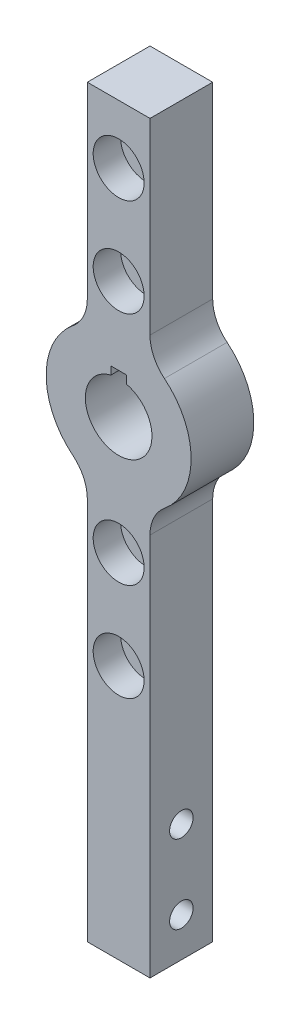
ISO-10303-21;
HEADER;
FILE_DESCRIPTION(('STEP AP214'),'2;1');
FILE_NAME('part.step','',(''),(''),'','','');
FILE_SCHEMA(('AUTOMOTIVE_DESIGN { 1 0 10303 214 1 1 1 1 }'));
ENDSEC;
DATA;
#1=APPLICATION_CONTEXT('core data for automotive mechanical design processes');
#2=APPLICATION_PROTOCOL_DEFINITION('international standard','automotive_design',2000,#1);
#3=PRODUCT_CONTEXT('',#1,'mechanical');
#4=PRODUCT('Part','Part','',(#3));
#5=PRODUCT_RELATED_PRODUCT_CATEGORY('part','',(#4));
#6=PRODUCT_DEFINITION_FORMATION('','',#4);
#7=PRODUCT_DEFINITION_CONTEXT('part definition',#1,'design');
#8=PRODUCT_DEFINITION('design','',#6,#7);
#9=PRODUCT_DEFINITION_SHAPE('','',#8);
#10=(LENGTH_UNIT() NAMED_UNIT(*) SI_UNIT(.MILLI.,.METRE.));
#11=(NAMED_UNIT(*) PLANE_ANGLE_UNIT() SI_UNIT($,.RADIAN.));
#12=(NAMED_UNIT(*) SI_UNIT($,.STERADIAN.) SOLID_ANGLE_UNIT());
#13=UNCERTAINTY_MEASURE_WITH_UNIT(LENGTH_MEASURE(1.E-05),#10,'distance_accuracy_value','');
#14=(GEOMETRIC_REPRESENTATION_CONTEXT(3) GLOBAL_UNCERTAINTY_ASSIGNED_CONTEXT((#13)) GLOBAL_UNIT_ASSIGNED_CONTEXT((#10,
#11,#12)) REPRESENTATION_CONTEXT('',''));
#15=CARTESIAN_POINT('',(0.,0.,0.));
#16=DIRECTION('',(0.,0.,1.));
#17=DIRECTION('',(1.,0.,0.));
#18=AXIS2_PLACEMENT_3D('',#15,#16,#17);
#19=CARTESIAN_POINT('',(0.,0.,-8.));
#20=DIRECTION('',(0.,0.,1.));
#21=DIRECTION('',(1.,0.,0.));
#22=AXIS2_PLACEMENT_3D('',#19,#20,#21);
#23=PLANE('',#22);
#24=CARTESIAN_POINT('',(0.,-55.,-8.));
#25=DIRECTION('',(0.,0.,-1.));
#26=DIRECTION('',(1.,0.,0.));
#27=AXIS2_PLACEMENT_3D('',#24,#25,#26);
#28=CIRCLE('',#27,3.);
#29=CARTESIAN_POINT('',(3.,-55.,-8.));
#30=VERTEX_POINT('',#29);
#31=EDGE_CURVE('E241',#30,#30,#28,.T.);
#32=ORIENTED_EDGE('',*,*,#31,.F.);
#33=EDGE_LOOP('',(#32));
#34=FACE_BOUND('',#33,.T.);
#35=CARTESIAN_POINT('',(0.,30.,-8.));
#36=DIRECTION('',(0.,0.,1.));
#37=DIRECTION('',(1.,0.,0.));
#38=AXIS2_PLACEMENT_3D('',#35,#36,#37);
#39=CIRCLE('',#38,3.);
#40=CARTESIAN_POINT('',(3.,30.,-8.));
#41=VERTEX_POINT('',#40);
#42=EDGE_CURVE('E247',#41,#41,#39,.T.);
#43=ORIENTED_EDGE('',*,*,#42,.T.);
#44=EDGE_LOOP('',(#43));
#45=FACE_BOUND('',#44,.T.);
#46=CARTESIAN_POINT('',(0.,55.,-8.));
#47=DIRECTION('',(0.,0.,1.));
#48=DIRECTION('',(1.,0.,0.));
#49=AXIS2_PLACEMENT_3D('',#46,#47,#48);
#50=CIRCLE('',#49,3.);
#51=CARTESIAN_POINT('',(3.,55.,-8.));
#52=VERTEX_POINT('',#51);
#53=EDGE_CURVE('E253',#52,#52,#50,.T.);
#54=ORIENTED_EDGE('',*,*,#53,.T.);
#55=EDGE_LOOP('',(#54));
#56=FACE_BOUND('',#55,.T.);
#57=CARTESIAN_POINT('',(0.,0.,-8.));
#58=DIRECTION('',(0.,0.,1.));
#59=DIRECTION('',(1.,0.,0.));
#60=AXIS2_PLACEMENT_3D('',#57,#58,#59);
#61=CIRCLE('',#60,18.5);
#62=CARTESIAN_POINT('',(11.6842105263158,-14.3432640767969,-8.));
#63=VERTEX_POINT('',#62);
#64=CARTESIAN_POINT('',(11.6842105263158,14.3432640767969,-8.));
#65=VERTEX_POINT('',#64);
#66=EDGE_CURVE('E174',#63,#65,#61,.T.);
#67=ORIENTED_EDGE('',*,*,#66,.F.);
#68=CARTESIAN_POINT('',(18.,-22.0963797939843,-8.));
#69=DIRECTION('',(0.,0.,1.));
#70=DIRECTION('',(1.,0.,0.));
#71=AXIS2_PLACEMENT_3D('',#68,#69,#70);
#72=CIRCLE('',#71,10.);
#73=CARTESIAN_POINT('',(8.00000000000002,-22.0963797939843,-8.));
#74=VERTEX_POINT('',#73);
#75=EDGE_CURVE('E209',#63,#74,#72,.T.);
#76=ORIENTED_EDGE('',*,*,#75,.T.);
#77=DIRECTION('',(0.,1.,0.));
#78=VECTOR('',#77,1.);
#79=CARTESIAN_POINT('',(8.00000000000001,-120.,-8.));
#80=LINE('',#79,#78);
#81=CARTESIAN_POINT('',(8.00000000000001,-120.,-8.));
#82=VERTEX_POINT('',#81);
#83=EDGE_CURVE('E292',#82,#74,#80,.T.);
#84=ORIENTED_EDGE('',*,*,#83,.F.);
#85=DIRECTION('',(1.,0.,0.));
#86=VECTOR('',#85,1.);
#87=CARTESIAN_POINT('',(-7.99999999999999,-120.,-8.));
#88=LINE('',#87,#86);
#89=CARTESIAN_POINT('',(-7.99999999999999,-120.,-8.));
#90=VERTEX_POINT('',#89);
#91=EDGE_CURVE('E300',#90,#82,#88,.T.);
#92=ORIENTED_EDGE('',*,*,#91,.F.);
#93=DIRECTION('',(0.,-1.,0.));
#94=VECTOR('',#93,1.);
#95=CARTESIAN_POINT('',(-7.99999999999999,-120.,-8.));
#96=LINE('',#95,#94);
#97=CARTESIAN_POINT('',(-8.00000000000001,-22.0963797939843,-8.));
#98=VERTEX_POINT('',#97);
#99=EDGE_CURVE('E307',#98,#90,#96,.T.);
#100=ORIENTED_EDGE('',*,*,#99,.F.);
#101=CARTESIAN_POINT('',(-18.,-22.0963797939843,-8.));
#102=DIRECTION('',(0.,0.,1.));
#103=DIRECTION('',(1.,0.,0.));
#104=AXIS2_PLACEMENT_3D('',#101,#102,#103);
#105=CIRCLE('',#104,10.);
#106=CARTESIAN_POINT('',(-11.6842105263158,-14.3432640767969,-8.));
#107=VERTEX_POINT('',#106);
#108=EDGE_CURVE('E213',#98,#107,#105,.T.);
#109=ORIENTED_EDGE('',*,*,#108,.T.);
#110=CARTESIAN_POINT('',(-11.6842105263158,14.3432640767969,-8.));
#111=VERTEX_POINT('',#110);
#112=EDGE_CURVE('E178',#111,#107,#61,.T.);
#113=ORIENTED_EDGE('',*,*,#112,.F.);
#114=CARTESIAN_POINT('',(-18.,22.0963797939844,-8.));
#115=DIRECTION('',(0.,0.,1.));
#116=DIRECTION('',(1.,0.,0.));
#117=AXIS2_PLACEMENT_3D('',#114,#115,#116);
#118=CIRCLE('',#117,10.);
#119=CARTESIAN_POINT('',(-7.99999999999999,22.0963797939844,-8.));
#120=VERTEX_POINT('',#119);
#121=EDGE_CURVE('E217',#111,#120,#118,.T.);
#122=ORIENTED_EDGE('',*,*,#121,.T.);
#123=DIRECTION('',(0.,-1.,0.));
#124=VECTOR('',#123,1.);
#125=CARTESIAN_POINT('',(-8.,70.,-8.));
#126=LINE('',#125,#124);
#127=CARTESIAN_POINT('',(-8.,70.,-8.));
#128=VERTEX_POINT('',#127);
#129=EDGE_CURVE('E319',#128,#120,#126,.T.);
#130=ORIENTED_EDGE('',*,*,#129,.F.);
#131=DIRECTION('',(-1.,0.,0.));
#132=VECTOR('',#131,1.);
#133=CARTESIAN_POINT('',(-8.,70.,-8.));
#134=LINE('',#133,#132);
#135=CARTESIAN_POINT('',(8.,70.,-8.));
#136=VERTEX_POINT('',#135);
#137=EDGE_CURVE('E326',#136,#128,#134,.T.);
#138=ORIENTED_EDGE('',*,*,#137,.F.);
#139=DIRECTION('',(0.,1.,0.));
#140=VECTOR('',#139,1.);
#141=CARTESIAN_POINT('',(8.,70.,-8.));
#142=LINE('',#141,#140);
#143=CARTESIAN_POINT('',(7.99999999999999,22.0963797939844,-8.));
#144=VERTEX_POINT('',#143);
#145=EDGE_CURVE('E315',#144,#136,#142,.T.);
#146=ORIENTED_EDGE('',*,*,#145,.F.);
#147=CARTESIAN_POINT('',(18.,22.0963797939844,-8.));
#148=DIRECTION('',(0.,0.,1.));
#149=DIRECTION('',(1.,0.,0.));
#150=AXIS2_PLACEMENT_3D('',#147,#148,#149);
#151=CIRCLE('',#150,10.);
#152=EDGE_CURVE('E44',#144,#65,#151,.T.);
#153=ORIENTED_EDGE('',*,*,#152,.T.);
#154=EDGE_LOOP('',(#67,#76,#84,#92,#100,#109,#113,#122,#130,#138,#146,#153));
#155=FACE_BOUND('',#154,.T.);
#156=CARTESIAN_POINT('',(0.,0.,-8.));
#157=DIRECTION('',(0.,0.,1.));
#158=DIRECTION('',(1.,0.,0.));
#159=AXIS2_PLACEMENT_3D('',#156,#157,#158);
#160=CIRCLE('',#159,8.5);
#161=CARTESIAN_POINT('',(-2.,8.26135582092915,-8.));
#162=VERTEX_POINT('',#161);
#163=CARTESIAN_POINT('',(2.,8.26135582092915,-8.));
#164=VERTEX_POINT('',#163);
#165=EDGE_CURVE('E175',#162,#164,#160,.T.);
#166=ORIENTED_EDGE('',*,*,#165,.T.);
#167=DIRECTION('',(0.,-1.,0.));
#168=VECTOR('',#167,1.);
#169=CARTESIAN_POINT('',(2.,10.3,-8.));
#170=LINE('',#169,#168);
#171=CARTESIAN_POINT('',(2.,10.3,-8.));
#172=VERTEX_POINT('',#171);
#173=EDGE_CURVE('E155',#172,#164,#170,.T.);
#174=ORIENTED_EDGE('',*,*,#173,.F.);
#175=DIRECTION('',(1.,0.,0.));
#176=VECTOR('',#175,1.);
#177=CARTESIAN_POINT('',(-2.,10.3,-8.));
#178=LINE('',#177,#176);
#179=CARTESIAN_POINT('',(-2.,10.3,-8.));
#180=VERTEX_POINT('',#179);
#181=EDGE_CURVE('E170',#180,#172,#178,.T.);
#182=ORIENTED_EDGE('',*,*,#181,.F.);
#183=DIRECTION('',(0.,1.,0.));
#184=VECTOR('',#183,1.);
#185=CARTESIAN_POINT('',(-2.,10.3,-8.));
#186=LINE('',#185,#184);
#187=EDGE_CURVE('E285',#162,#180,#186,.T.);
#188=ORIENTED_EDGE('',*,*,#187,.F.);
#189=EDGE_LOOP('',(#166,#174,#182,#188));
#190=FACE_BOUND('',#189,.T.);
#191=CARTESIAN_POINT('',(0.,-30.,-8.));
#192=DIRECTION('',(0.,0.,-1.));
#193=DIRECTION('',(1.,0.,0.));
#194=AXIS2_PLACEMENT_3D('',#191,#192,#193);
#195=CIRCLE('',#194,3.);
#196=CARTESIAN_POINT('',(3.,-30.,-8.));
#197=VERTEX_POINT('',#196);
#198=EDGE_CURVE('E228',#197,#197,#195,.T.);
#199=ORIENTED_EDGE('',*,*,#198,.F.);
#200=EDGE_LOOP('',(#199));
#201=FACE_BOUND('',#200,.T.);
#202=ADVANCED_FACE('F35',(#34,#45,#56,#155,#190,#201),#23,.F.);
#203=CARTESIAN_POINT('',(0.,-30.,1.));
#204=DIRECTION('',(0.,0.,1.));
#205=DIRECTION('',(1.,0.,0.));
#206=AXIS2_PLACEMENT_3D('',#203,#204,#205);
#207=PLANE('',#206);
#208=CARTESIAN_POINT('',(0.,-30.,1.));
#209=DIRECTION('',(0.,0.,-1.));
#210=DIRECTION('',(1.,0.,0.));
#211=AXIS2_PLACEMENT_3D('',#208,#209,#210);
#212=CIRCLE('',#211,6.5);
#213=CARTESIAN_POINT('',(6.5,-30.,1.));
#214=VERTEX_POINT('',#213);
#215=EDGE_CURVE('E259',#214,#214,#212,.T.);
#216=ORIENTED_EDGE('',*,*,#215,.F.);
#217=EDGE_LOOP('',(#216));
#218=FACE_BOUND('',#217,.T.);
#219=CARTESIAN_POINT('',(0.,-30.,1.));
#220=DIRECTION('',(0.,0.,-1.));
#221=DIRECTION('',(1.,0.,0.));
#222=AXIS2_PLACEMENT_3D('',#219,#220,#221);
#223=CIRCLE('',#222,3.);
#224=CARTESIAN_POINT('',(3.,-30.,1.));
#225=VERTEX_POINT('',#224);
#226=EDGE_CURVE('E223',#225,#225,#223,.T.);
#227=ORIENTED_EDGE('',*,*,#226,.T.);
#228=EDGE_LOOP('',(#227));
#229=FACE_BOUND('',#228,.T.);
#230=ADVANCED_FACE('F397',(#218,#229),#207,.T.);
#231=CARTESIAN_POINT('',(0.,-55.,1.));
#232=DIRECTION('',(0.,0.,1.));
#233=DIRECTION('',(1.,0.,0.));
#234=AXIS2_PLACEMENT_3D('',#231,#232,#233);
#235=PLANE('',#234);
#236=CARTESIAN_POINT('',(0.,-55.,1.));
#237=DIRECTION('',(0.,0.,-1.));
#238=DIRECTION('',(1.,0.,0.));
#239=AXIS2_PLACEMENT_3D('',#236,#237,#238);
#240=CIRCLE('',#239,6.5);
#241=CARTESIAN_POINT('',(6.5,-55.,1.));
#242=VERTEX_POINT('',#241);
#243=EDGE_CURVE('E265',#242,#242,#240,.T.);
#244=ORIENTED_EDGE('',*,*,#243,.F.);
#245=EDGE_LOOP('',(#244));
#246=FACE_BOUND('',#245,.T.);
#247=CARTESIAN_POINT('',(0.,-55.,1.));
#248=DIRECTION('',(0.,0.,-1.));
#249=DIRECTION('',(1.,0.,0.));
#250=AXIS2_PLACEMENT_3D('',#247,#248,#249);
#251=CIRCLE('',#250,3.);
#252=CARTESIAN_POINT('',(3.,-55.,1.));
#253=VERTEX_POINT('',#252);
#254=EDGE_CURVE('E239',#253,#253,#251,.T.);
#255=ORIENTED_EDGE('',*,*,#254,.T.);
#256=EDGE_LOOP('',(#255));
#257=FACE_BOUND('',#256,.T.);
#258=ADVANCED_FACE('F403',(#246,#257),#235,.T.);
#259=CARTESIAN_POINT('',(0.,0.,8.));
#260=DIRECTION('',(0.,0.,1.));
#261=DIRECTION('',(1.,0.,0.));
#262=AXIS2_PLACEMENT_3D('',#259,#260,#261);
#263=PLANE('',#262);
#264=CARTESIAN_POINT('',(0.,-55.,8.));
#265=DIRECTION('',(0.,0.,-1.));
#266=DIRECTION('',(1.,0.,0.));
#267=AXIS2_PLACEMENT_3D('',#264,#265,#266);
#268=CIRCLE('',#267,6.5);
#269=CARTESIAN_POINT('',(6.5,-55.,8.));
#270=VERTEX_POINT('',#269);
#271=EDGE_CURVE('E262',#270,#270,#268,.T.);
#272=ORIENTED_EDGE('',*,*,#271,.T.);
#273=EDGE_LOOP('',(#272));
#274=FACE_BOUND('',#273,.T.);
#275=CARTESIAN_POINT('',(0.,30.,8.));
#276=DIRECTION('',(0.,0.,1.));
#277=DIRECTION('',(1.,0.,0.));
#278=AXIS2_PLACEMENT_3D('',#275,#276,#277);
#279=CIRCLE('',#278,6.5);
#280=CARTESIAN_POINT('',(6.5,30.,8.));
#281=VERTEX_POINT('',#280);
#282=EDGE_CURVE('E268',#281,#281,#279,.T.);
#283=ORIENTED_EDGE('',*,*,#282,.F.);
#284=EDGE_LOOP('',(#283));
#285=FACE_BOUND('',#284,.T.);
#286=CARTESIAN_POINT('',(0.,55.,8.));
#287=DIRECTION('',(0.,0.,1.));
#288=DIRECTION('',(1.,0.,0.));
#289=AXIS2_PLACEMENT_3D('',#286,#287,#288);
#290=CIRCLE('',#289,6.5);
#291=CARTESIAN_POINT('',(6.5,55.,8.));
#292=VERTEX_POINT('',#291);
#293=EDGE_CURVE('E274',#292,#292,#290,.T.);
#294=ORIENTED_EDGE('',*,*,#293,.F.);
#295=EDGE_LOOP('',(#294));
#296=FACE_BOUND('',#295,.T.);
#297=DIRECTION('',(0.,-1.,0.));
#298=VECTOR('',#297,1.);
#299=CARTESIAN_POINT('',(2.,10.3,8.));
#300=LINE('',#299,#298);
#301=CARTESIAN_POINT('',(2.,10.3,8.));
#302=VERTEX_POINT('',#301);
#303=CARTESIAN_POINT('',(2.,8.26135582092915,8.));
#304=VERTEX_POINT('',#303);
#305=EDGE_CURVE('E152',#302,#304,#300,.T.);
#306=ORIENTED_EDGE('',*,*,#305,.T.);
#307=CARTESIAN_POINT('',(0.,0.,8.));
#308=DIRECTION('',(0.,0.,1.));
#309=DIRECTION('',(1.,0.,0.));
#310=AXIS2_PLACEMENT_3D('',#307,#308,#309);
#311=CIRCLE('',#310,8.5);
#312=CARTESIAN_POINT('',(-2.,8.26135582092915,8.));
#313=VERTEX_POINT('',#312);
#314=EDGE_CURVE('E167',#313,#304,#311,.T.);
#315=ORIENTED_EDGE('',*,*,#314,.F.);
#316=DIRECTION('',(0.,1.,0.));
#317=VECTOR('',#316,1.);
#318=CARTESIAN_POINT('',(-2.,10.3,8.));
#319=LINE('',#318,#317);
#320=CARTESIAN_POINT('',(-2.,10.3,8.));
#321=VERTEX_POINT('',#320);
#322=EDGE_CURVE('E169',#313,#321,#319,.T.);
#323=ORIENTED_EDGE('',*,*,#322,.T.);
#324=DIRECTION('',(1.,0.,0.));
#325=VECTOR('',#324,1.);
#326=CARTESIAN_POINT('',(-2.,10.3,8.));
#327=LINE('',#326,#325);
#328=EDGE_CURVE('E161',#321,#302,#327,.T.);
#329=ORIENTED_EDGE('',*,*,#328,.T.);
#330=EDGE_LOOP('',(#306,#315,#323,#329));
#331=FACE_BOUND('',#330,.T.);
#332=DIRECTION('',(0.,-1.,0.));
#333=VECTOR('',#332,1.);
#334=CARTESIAN_POINT('',(-8.,70.,8.));
#335=LINE('',#334,#333);
#336=CARTESIAN_POINT('',(-8.,70.,8.));
#337=VERTEX_POINT('',#336);
#338=CARTESIAN_POINT('',(-7.99999999999999,22.0963797939844,8.));
#339=VERTEX_POINT('',#338);
#340=EDGE_CURVE('E321',#337,#339,#335,.T.);
#341=ORIENTED_EDGE('',*,*,#340,.T.);
#342=CARTESIAN_POINT('',(-18.,22.0963797939844,8.));
#343=DIRECTION('',(0.,0.,1.));
#344=DIRECTION('',(1.,0.,0.));
#345=AXIS2_PLACEMENT_3D('',#342,#343,#344);
#346=CIRCLE('',#345,10.);
#347=CARTESIAN_POINT('',(-11.6842105263158,14.3432640767969,8.));
#348=VERTEX_POINT('',#347);
#349=EDGE_CURVE('E219',#339,#348,#346,.F.);
#350=ORIENTED_EDGE('',*,*,#349,.T.);
#351=CARTESIAN_POINT('',(0.,0.,8.));
#352=DIRECTION('',(0.,0.,1.));
#353=DIRECTION('',(1.,0.,0.));
#354=AXIS2_PLACEMENT_3D('',#351,#352,#353);
#355=CIRCLE('',#354,18.5);
#356=CARTESIAN_POINT('',(-11.6842105263158,-14.3432640767969,8.));
#357=VERTEX_POINT('',#356);
#358=EDGE_CURVE('E185',#348,#357,#355,.T.);
#359=ORIENTED_EDGE('',*,*,#358,.T.);
#360=CARTESIAN_POINT('',(-18.,-22.0963797939843,8.));
#361=DIRECTION('',(0.,0.,1.));
#362=DIRECTION('',(1.,0.,0.));
#363=AXIS2_PLACEMENT_3D('',#360,#361,#362);
#364=CIRCLE('',#363,10.);
#365=CARTESIAN_POINT('',(-8.00000000000001,-22.0963797939843,8.));
#366=VERTEX_POINT('',#365);
#367=EDGE_CURVE('E215',#357,#366,#364,.F.);
#368=ORIENTED_EDGE('',*,*,#367,.T.);
#369=DIRECTION('',(0.,-1.,0.));
#370=VECTOR('',#369,1.);
#371=CARTESIAN_POINT('',(-7.99999999999999,-120.,8.));
#372=LINE('',#371,#370);
#373=CARTESIAN_POINT('',(-7.99999999999999,-120.,8.));
#374=VERTEX_POINT('',#373);
#375=EDGE_CURVE('E299',#366,#374,#372,.T.);
#376=ORIENTED_EDGE('',*,*,#375,.T.);
#377=DIRECTION('',(1.,0.,0.));
#378=VECTOR('',#377,1.);
#379=CARTESIAN_POINT('',(-7.99999999999999,-120.,8.));
#380=LINE('',#379,#378);
#381=CARTESIAN_POINT('',(8.00000000000001,-120.,8.));
#382=VERTEX_POINT('',#381);
#383=EDGE_CURVE('E302',#374,#382,#380,.T.);
#384=ORIENTED_EDGE('',*,*,#383,.T.);
#385=DIRECTION('',(0.,1.,0.));
#386=VECTOR('',#385,1.);
#387=CARTESIAN_POINT('',(8.00000000000001,-120.,8.));
#388=LINE('',#387,#386);
#389=CARTESIAN_POINT('',(8.00000000000002,-22.0963797939843,8.));
#390=VERTEX_POINT('',#389);
#391=EDGE_CURVE('E296',#382,#390,#388,.T.);
#392=ORIENTED_EDGE('',*,*,#391,.T.);
#393=CARTESIAN_POINT('',(18.,-22.0963797939843,8.));
#394=DIRECTION('',(0.,0.,1.));
#395=DIRECTION('',(1.,0.,0.));
#396=AXIS2_PLACEMENT_3D('',#393,#394,#395);
#397=CIRCLE('',#396,10.);
#398=CARTESIAN_POINT('',(11.6842105263158,-14.3432640767969,8.));
#399=VERTEX_POINT('',#398);
#400=EDGE_CURVE('E211',#390,#399,#397,.F.);
#401=ORIENTED_EDGE('',*,*,#400,.T.);
#402=CARTESIAN_POINT('',(11.6842105263158,14.3432640767969,8.));
#403=VERTEX_POINT('',#402);
#404=EDGE_CURVE('E188',#399,#403,#355,.T.);
#405=ORIENTED_EDGE('',*,*,#404,.T.);
#406=CARTESIAN_POINT('',(18.,22.0963797939844,8.));
#407=DIRECTION('',(0.,0.,1.));
#408=DIRECTION('',(1.,0.,0.));
#409=AXIS2_PLACEMENT_3D('',#406,#407,#408);
#410=CIRCLE('',#409,10.);
#411=CARTESIAN_POINT('',(7.99999999999999,22.0963797939844,8.));
#412=VERTEX_POINT('',#411);
#413=EDGE_CURVE('E11',#403,#412,#410,.F.);
#414=ORIENTED_EDGE('',*,*,#413,.T.);
#415=DIRECTION('',(0.,1.,0.));
#416=VECTOR('',#415,1.);
#417=CARTESIAN_POINT('',(8.,70.,8.));
#418=LINE('',#417,#416);
#419=CARTESIAN_POINT('',(8.,70.,8.));
#420=VERTEX_POINT('',#419);
#421=EDGE_CURVE('E316',#412,#420,#418,.T.);
#422=ORIENTED_EDGE('',*,*,#421,.T.);
#423=DIRECTION('',(-1.,0.,0.));
#424=VECTOR('',#423,1.);
#425=CARTESIAN_POINT('',(-8.,70.,8.));
#426=LINE('',#425,#424);
#427=EDGE_CURVE('E318',#420,#337,#426,.T.);
#428=ORIENTED_EDGE('',*,*,#427,.T.);
#429=EDGE_LOOP('',(#341,#350,#359,#368,#376,#384,#392,#401,#405,#414,#422,#428));
#430=FACE_BOUND('',#429,.T.);
#431=CARTESIAN_POINT('',(0.,-30.,8.));
#432=DIRECTION('',(0.,0.,-1.));
#433=DIRECTION('',(1.,0.,0.));
#434=AXIS2_PLACEMENT_3D('',#431,#432,#433);
#435=CIRCLE('',#434,6.5);
#436=CARTESIAN_POINT('',(6.5,-30.,8.));
#437=VERTEX_POINT('',#436);
#438=EDGE_CURVE('E256',#437,#437,#435,.T.);
#439=ORIENTED_EDGE('',*,*,#438,.T.);
#440=EDGE_LOOP('',(#439));
#441=FACE_BOUND('',#440,.T.);
#442=ADVANCED_FACE('F165',(#274,#285,#296,#331,#430,#441),#263,.T.);
#443=CARTESIAN_POINT('',(0.,0.,8.));
#444=DIRECTION('',(0.,0.,-1.));
#445=DIRECTION('',(-1.,0.,0.));
#446=AXIS2_PLACEMENT_3D('',#443,#444,#445);
#447=CYLINDRICAL_SURFACE('',#446,18.5);
#448=ORIENTED_EDGE('',*,*,#404,.F.);
#449=DIRECTION('',(0.,0.,-1.));
#450=VECTOR('',#449,1.);
#451=CARTESIAN_POINT('',(11.6842105263158,-14.3432640767968,8.));
#452=LINE('',#451,#450);
#453=EDGE_CURVE('E192',#399,#63,#452,.T.);
#454=ORIENTED_EDGE('',*,*,#453,.T.);
#455=ORIENTED_EDGE('',*,*,#66,.T.);
#456=DIRECTION('',(0.,0.,-1.));
#457=VECTOR('',#456,1.);
#458=CARTESIAN_POINT('',(11.6842105263158,14.3432640767969,8.));
#459=LINE('',#458,#457);
#460=EDGE_CURVE('E187',#65,#403,#459,.F.);
#461=ORIENTED_EDGE('',*,*,#460,.T.);
#462=EDGE_LOOP('',(#448,#454,#455,#461));
#463=FACE_BOUND('',#462,.T.);
#464=ADVANCED_FACE('F381',(#463),#447,.T.);
#465=ORIENTED_EDGE('',*,*,#112,.T.);
#466=DIRECTION('',(0.,0.,-1.));
#467=VECTOR('',#466,1.);
#468=CARTESIAN_POINT('',(-11.6842105263158,-14.3432640767969,8.));
#469=LINE('',#468,#467);
#470=EDGE_CURVE('E203',#107,#357,#469,.F.);
#471=ORIENTED_EDGE('',*,*,#470,.T.);
#472=ORIENTED_EDGE('',*,*,#358,.F.);
#473=DIRECTION('',(0.,0.,-1.));
#474=VECTOR('',#473,1.);
#475=CARTESIAN_POINT('',(-11.6842105263158,14.3432640767969,8.));
#476=LINE('',#475,#474);
#477=EDGE_CURVE('E200',#348,#111,#476,.T.);
#478=ORIENTED_EDGE('',*,*,#477,.T.);
#479=EDGE_LOOP('',(#465,#471,#472,#478));
#480=FACE_BOUND('',#479,.T.);
#481=ADVANCED_FACE('F357',(#480),#447,.T.);
#482=CARTESIAN_POINT('',(0.,0.,8.));
#483=DIRECTION('',(0.,0.,-1.));
#484=DIRECTION('',(-1.,0.,0.));
#485=AXIS2_PLACEMENT_3D('',#482,#483,#484);
#486=CYLINDRICAL_SURFACE('',#485,8.5);
#487=DIRECTION('',(0.,0.,-1.));
#488=VECTOR('',#487,1.);
#489=CARTESIAN_POINT('',(-2.,8.26135582092915,8.));
#490=LINE('',#489,#488);
#491=EDGE_CURVE('E160',#313,#162,#490,.T.);
#492=ORIENTED_EDGE('',*,*,#491,.F.);
#493=ORIENTED_EDGE('',*,*,#314,.T.);
#494=DIRECTION('',(0.,0.,-1.));
#495=VECTOR('',#494,1.);
#496=CARTESIAN_POINT('',(2.,8.26135582092915,8.));
#497=LINE('',#496,#495);
#498=EDGE_CURVE('E149',#304,#164,#497,.T.);
#499=ORIENTED_EDGE('',*,*,#498,.T.);
#500=ORIENTED_EDGE('',*,*,#165,.F.);
#501=EDGE_LOOP('',(#492,#493,#499,#500));
#502=FACE_BOUND('',#501,.T.);
#503=ADVANCED_FACE('F173',(#502),#486,.F.);
#504=CARTESIAN_POINT('',(8.,70.,8.));
#505=DIRECTION('',(-1.,0.,0.));
#506=DIRECTION('',(0.,-1.,0.));
#507=AXIS2_PLACEMENT_3D('',#504,#505,#506);
#508=PLANE('',#507);
#509=ORIENTED_EDGE('',*,*,#421,.F.);
#510=DIRECTION('',(0.,0.,1.));
#511=VECTOR('',#510,1.);
#512=CARTESIAN_POINT('',(7.99999999999999,22.0963797939844,-8.));
#513=LINE('',#512,#511);
#514=EDGE_CURVE('E207',#412,#144,#513,.F.);
#515=ORIENTED_EDGE('',*,*,#514,.T.);
#516=ORIENTED_EDGE('',*,*,#145,.T.);
#517=DIRECTION('',(0.,0.,-1.));
#518=VECTOR('',#517,1.);
#519=CARTESIAN_POINT('',(8.,70.,8.));
#520=LINE('',#519,#518);
#521=EDGE_CURVE('E180',#420,#136,#520,.T.);
#522=ORIENTED_EDGE('',*,*,#521,.F.);
#523=EDGE_LOOP('',(#509,#515,#516,#522));
#524=FACE_BOUND('',#523,.T.);
#525=ADVANCED_FACE('F341',(#524),#508,.F.);
#526=CARTESIAN_POINT('',(-8.,70.,8.));
#527=DIRECTION('',(0.,-1.,0.));
#528=DIRECTION('',(0.,0.,-1.));
#529=AXIS2_PLACEMENT_3D('',#526,#527,#528);
#530=PLANE('',#529);
#531=ORIENTED_EDGE('',*,*,#137,.T.);
#532=DIRECTION('',(0.,0.,-1.));
#533=VECTOR('',#532,1.);
#534=CARTESIAN_POINT('',(-8.,70.,8.));
#535=LINE('',#534,#533);
#536=EDGE_CURVE('E324',#337,#128,#535,.T.);
#537=ORIENTED_EDGE('',*,*,#536,.F.);
#538=ORIENTED_EDGE('',*,*,#427,.F.);
#539=ORIENTED_EDGE('',*,*,#521,.T.);
#540=EDGE_LOOP('',(#531,#537,#538,#539));
#541=FACE_BOUND('',#540,.T.);
#542=ADVANCED_FACE('F338',(#541),#530,.F.);
#543=CARTESIAN_POINT('',(-8.,70.,8.));
#544=DIRECTION('',(1.,0.,0.));
#545=DIRECTION('',(0.,1.,0.));
#546=AXIS2_PLACEMENT_3D('',#543,#544,#545);
#547=PLANE('',#546);
#548=ORIENTED_EDGE('',*,*,#129,.T.);
#549=DIRECTION('',(0.,0.,1.));
#550=VECTOR('',#549,1.);
#551=CARTESIAN_POINT('',(-7.99999999999999,22.0963797939844,8.));
#552=LINE('',#551,#550);
#553=EDGE_CURVE('E205',#120,#339,#552,.T.);
#554=ORIENTED_EDGE('',*,*,#553,.T.);
#555=ORIENTED_EDGE('',*,*,#340,.F.);
#556=ORIENTED_EDGE('',*,*,#536,.T.);
#557=EDGE_LOOP('',(#548,#554,#555,#556));
#558=FACE_BOUND('',#557,.T.);
#559=ADVANCED_FACE('F348',(#558),#547,.F.);
#560=CARTESIAN_POINT('',(8.00000000000001,-120.,8.));
#561=DIRECTION('',(-1.,0.,0.));
#562=DIRECTION('',(0.,-1.,0.));
#563=AXIS2_PLACEMENT_3D('',#560,#561,#562);
#564=PLANE('',#563);
#565=CARTESIAN_POINT('',(8.00000000000002,-90.,0.));
#566=DIRECTION('',(1.,0.,0.));
#567=DIRECTION('',(0.,1.,0.));
#568=AXIS2_PLACEMENT_3D('',#565,#566,#567);
#569=CIRCLE('',#568,3.);
#570=CARTESIAN_POINT('',(8.00000000000002,-87.,0.));
#571=VERTEX_POINT('',#570);
#572=EDGE_CURVE('E235',#571,#571,#569,.T.);
#573=ORIENTED_EDGE('',*,*,#572,.F.);
#574=EDGE_LOOP('',(#573));
#575=FACE_BOUND('',#574,.T.);
#576=CARTESIAN_POINT('',(8.00000000000003,-110.,0.));
#577=DIRECTION('',(1.,0.,0.));
#578=DIRECTION('',(0.,1.,0.));
#579=AXIS2_PLACEMENT_3D('',#576,#577,#578);
#580=CIRCLE('',#579,3.);
#581=CARTESIAN_POINT('',(8.00000000000003,-107.,0.));
#582=VERTEX_POINT('',#581);
#583=EDGE_CURVE('E224',#582,#582,#580,.T.);
#584=ORIENTED_EDGE('',*,*,#583,.F.);
#585=EDGE_LOOP('',(#584));
#586=FACE_BOUND('',#585,.T.);
#587=ORIENTED_EDGE('',*,*,#83,.T.);
#588=DIRECTION('',(0.,0.,1.));
#589=VECTOR('',#588,1.);
#590=CARTESIAN_POINT('',(8.00000000000002,-22.0963797939843,8.));
#591=LINE('',#590,#589);
#592=EDGE_CURVE('E195',#74,#390,#591,.T.);
#593=ORIENTED_EDGE('',*,*,#592,.T.);
#594=ORIENTED_EDGE('',*,*,#391,.F.);
#595=DIRECTION('',(0.,0.,-1.));
#596=VECTOR('',#595,1.);
#597=CARTESIAN_POINT('',(8.00000000000001,-120.,8.));
#598=LINE('',#597,#596);
#599=EDGE_CURVE('E304',#382,#82,#598,.T.);
#600=ORIENTED_EDGE('',*,*,#599,.T.);
#601=EDGE_LOOP('',(#587,#593,#594,#600));
#602=FACE_BOUND('',#601,.T.);
#603=ADVANCED_FACE('F383',(#575,#586,#602),#564,.F.);
#604=CARTESIAN_POINT('',(-7.99999999999999,-120.,8.));
#605=DIRECTION('',(1.,0.,0.));
#606=DIRECTION('',(0.,1.,0.));
#607=AXIS2_PLACEMENT_3D('',#604,#605,#606);
#608=PLANE('',#607);
#609=CARTESIAN_POINT('',(-7.99999999999999,-90.,0.));
#610=DIRECTION('',(1.,0.,0.));
#611=DIRECTION('',(0.,1.,0.));
#612=AXIS2_PLACEMENT_3D('',#609,#610,#611);
#613=CIRCLE('',#612,3.);
#614=CARTESIAN_POINT('',(-7.99999999999999,-87.,0.));
#615=VERTEX_POINT('',#614);
#616=EDGE_CURVE('E39',#615,#615,#613,.T.);
#617=ORIENTED_EDGE('',*,*,#616,.T.);
#618=EDGE_LOOP('',(#617));
#619=FACE_BOUND('',#618,.T.);
#620=CARTESIAN_POINT('',(-7.99999999999999,-110.,0.));
#621=DIRECTION('',(1.,0.,0.));
#622=DIRECTION('',(0.,1.,0.));
#623=AXIS2_PLACEMENT_3D('',#620,#621,#622);
#624=CIRCLE('',#623,3.);
#625=CARTESIAN_POINT('',(-7.99999999999999,-107.,0.));
#626=VERTEX_POINT('',#625);
#627=EDGE_CURVE('E221',#626,#626,#624,.T.);
#628=ORIENTED_EDGE('',*,*,#627,.T.);
#629=EDGE_LOOP('',(#628));
#630=FACE_BOUND('',#629,.T.);
#631=ORIENTED_EDGE('',*,*,#375,.F.);
#632=DIRECTION('',(0.,0.,1.));
#633=VECTOR('',#632,1.);
#634=CARTESIAN_POINT('',(-8.00000000000001,-22.0963797939843,-8.));
#635=LINE('',#634,#633);
#636=EDGE_CURVE('E197',#366,#98,#635,.F.);
#637=ORIENTED_EDGE('',*,*,#636,.T.);
#638=ORIENTED_EDGE('',*,*,#99,.T.);
#639=DIRECTION('',(0.,0.,-1.));
#640=VECTOR('',#639,1.);
#641=CARTESIAN_POINT('',(-7.99999999999999,-120.,8.));
#642=LINE('',#641,#640);
#643=EDGE_CURVE('E312',#374,#90,#642,.T.);
#644=ORIENTED_EDGE('',*,*,#643,.F.);
#645=EDGE_LOOP('',(#631,#637,#638,#644));
#646=FACE_BOUND('',#645,.T.);
#647=ADVANCED_FACE('F365',(#619,#630,#646),#608,.F.);
#648=CARTESIAN_POINT('',(-7.99999999999999,-120.,8.));
#649=DIRECTION('',(0.,1.,0.));
#650=DIRECTION('',(0.,0.,1.));
#651=AXIS2_PLACEMENT_3D('',#648,#649,#650);
#652=PLANE('',#651);
#653=ORIENTED_EDGE('',*,*,#91,.T.);
#654=ORIENTED_EDGE('',*,*,#599,.F.);
#655=ORIENTED_EDGE('',*,*,#383,.F.);
#656=ORIENTED_EDGE('',*,*,#643,.T.);
#657=EDGE_LOOP('',(#653,#654,#655,#656));
#658=FACE_BOUND('',#657,.T.);
#659=ADVANCED_FACE('F371',(#658),#652,.F.);
#660=CARTESIAN_POINT('',(2.,10.3,8.));
#661=DIRECTION('',(1.,0.,0.));
#662=DIRECTION('',(0.,0.,-1.));
#663=AXIS2_PLACEMENT_3D('',#660,#661,#662);
#664=PLANE('',#663);
#665=ORIENTED_EDGE('',*,*,#173,.T.);
#666=ORIENTED_EDGE('',*,*,#498,.F.);
#667=ORIENTED_EDGE('',*,*,#305,.F.);
#668=DIRECTION('',(0.,0.,-1.));
#669=VECTOR('',#668,1.);
#670=CARTESIAN_POINT('',(2.,10.3,8.));
#671=LINE('',#670,#669);
#672=EDGE_CURVE('E290',#302,#172,#671,.T.);
#673=ORIENTED_EDGE('',*,*,#672,.T.);
#674=EDGE_LOOP('',(#665,#666,#667,#673));
#675=FACE_BOUND('',#674,.T.);
#676=ADVANCED_FACE('F151',(#675),#664,.F.);
#677=CARTESIAN_POINT('',(-2.,10.3,8.));
#678=DIRECTION('',(0.,1.,0.));
#679=DIRECTION('',(0.,0.,1.));
#680=AXIS2_PLACEMENT_3D('',#677,#678,#679);
#681=PLANE('',#680);
#682=ORIENTED_EDGE('',*,*,#181,.T.);
#683=ORIENTED_EDGE('',*,*,#672,.F.);
#684=ORIENTED_EDGE('',*,*,#328,.F.);
#685=DIRECTION('',(0.,0.,-1.));
#686=VECTOR('',#685,1.);
#687=CARTESIAN_POINT('',(-2.,10.3,8.));
#688=LINE('',#687,#686);
#689=EDGE_CURVE('E293',#321,#180,#688,.T.);
#690=ORIENTED_EDGE('',*,*,#689,.T.);
#691=EDGE_LOOP('',(#682,#683,#684,#690));
#692=FACE_BOUND('',#691,.T.);
#693=ADVANCED_FACE('F438',(#692),#681,.F.);
#694=CARTESIAN_POINT('',(-2.,10.3,8.));
#695=DIRECTION('',(-1.,0.,0.));
#696=DIRECTION('',(0.,0.,1.));
#697=AXIS2_PLACEMENT_3D('',#694,#695,#696);
#698=PLANE('',#697);
#699=ORIENTED_EDGE('',*,*,#187,.T.);
#700=ORIENTED_EDGE('',*,*,#689,.F.);
#701=ORIENTED_EDGE('',*,*,#322,.F.);
#702=ORIENTED_EDGE('',*,*,#491,.T.);
#703=EDGE_LOOP('',(#699,#700,#701,#702));
#704=FACE_BOUND('',#703,.T.);
#705=ADVANCED_FACE('F415',(#704),#698,.F.);
#706=CARTESIAN_POINT('',(18.,-22.0963797939843,8.));
#707=DIRECTION('',(0.,0.,-1.));
#708=DIRECTION('',(-1.,0.,0.));
#709=AXIS2_PLACEMENT_3D('',#706,#707,#708);
#710=CYLINDRICAL_SURFACE('',#709,10.);
#711=ORIENTED_EDGE('',*,*,#400,.F.);
#712=ORIENTED_EDGE('',*,*,#592,.F.);
#713=ORIENTED_EDGE('',*,*,#75,.F.);
#714=ORIENTED_EDGE('',*,*,#453,.F.);
#715=EDGE_LOOP('',(#711,#712,#713,#714));
#716=FACE_BOUND('',#715,.T.);
#717=ADVANCED_FACE('F379',(#716),#710,.F.);
#718=CARTESIAN_POINT('',(-18.,-22.0963797939843,8.));
#719=DIRECTION('',(0.,0.,-1.));
#720=DIRECTION('',(-1.,0.,0.));
#721=AXIS2_PLACEMENT_3D('',#718,#719,#720);
#722=CYLINDRICAL_SURFACE('',#721,10.);
#723=ORIENTED_EDGE('',*,*,#367,.F.);
#724=ORIENTED_EDGE('',*,*,#470,.F.);
#725=ORIENTED_EDGE('',*,*,#108,.F.);
#726=ORIENTED_EDGE('',*,*,#636,.F.);
#727=EDGE_LOOP('',(#723,#724,#725,#726));
#728=FACE_BOUND('',#727,.T.);
#729=ADVANCED_FACE('F360',(#728),#722,.F.);
#730=CARTESIAN_POINT('',(-18.,22.0963797939844,8.));
#731=DIRECTION('',(0.,0.,-1.));
#732=DIRECTION('',(-1.,0.,0.));
#733=AXIS2_PLACEMENT_3D('',#730,#731,#732);
#734=CYLINDRICAL_SURFACE('',#733,10.);
#735=ORIENTED_EDGE('',*,*,#349,.F.);
#736=ORIENTED_EDGE('',*,*,#553,.F.);
#737=ORIENTED_EDGE('',*,*,#121,.F.);
#738=ORIENTED_EDGE('',*,*,#477,.F.);
#739=EDGE_LOOP('',(#735,#736,#737,#738));
#740=FACE_BOUND('',#739,.T.);
#741=ADVANCED_FACE('F351',(#740),#734,.F.);
#742=CARTESIAN_POINT('',(18.,22.0963797939844,8.));
#743=DIRECTION('',(0.,0.,-1.));
#744=DIRECTION('',(-1.,0.,0.));
#745=AXIS2_PLACEMENT_3D('',#742,#743,#744);
#746=CYLINDRICAL_SURFACE('',#745,10.);
#747=ORIENTED_EDGE('',*,*,#413,.F.);
#748=ORIENTED_EDGE('',*,*,#460,.F.);
#749=ORIENTED_EDGE('',*,*,#152,.F.);
#750=ORIENTED_EDGE('',*,*,#514,.F.);
#751=EDGE_LOOP('',(#747,#748,#749,#750));
#752=FACE_BOUND('',#751,.T.);
#753=ADVANCED_FACE('F37',(#752),#746,.F.);
#754=CARTESIAN_POINT('',(0.,55.,1.));
#755=DIRECTION('',(0.,0.,1.));
#756=DIRECTION('',(1.,0.,0.));
#757=AXIS2_PLACEMENT_3D('',#754,#755,#756);
#758=CYLINDRICAL_SURFACE('',#757,6.5);
#759=CARTESIAN_POINT('',(0.,55.,1.));
#760=DIRECTION('',(0.,0.,1.));
#761=DIRECTION('',(1.,0.,0.));
#762=AXIS2_PLACEMENT_3D('',#759,#760,#761);
#763=CIRCLE('',#762,6.5);
#764=CARTESIAN_POINT('',(6.5,55.,1.));
#765=VERTEX_POINT('',#764);
#766=EDGE_CURVE('E277',#765,#765,#763,.T.);
#767=ORIENTED_EDGE('',*,*,#766,.F.);
#768=EDGE_LOOP('',(#767));
#769=FACE_BOUND('',#768,.T.);
#770=ORIENTED_EDGE('',*,*,#293,.T.);
#771=EDGE_LOOP('',(#770));
#772=FACE_BOUND('',#771,.T.);
#773=ADVANCED_FACE('F421',(#769,#772),#758,.F.);
#774=CARTESIAN_POINT('',(0.,55.,1.));
#775=DIRECTION('',(0.,0.,1.));
#776=DIRECTION('',(1.,0.,0.));
#777=AXIS2_PLACEMENT_3D('',#774,#775,#776);
#778=PLANE('',#777);
#779=CARTESIAN_POINT('',(0.,55.,1.));
#780=DIRECTION('',(0.,0.,1.));
#781=DIRECTION('',(1.,0.,0.));
#782=AXIS2_PLACEMENT_3D('',#779,#780,#781);
#783=CIRCLE('',#782,3.);
#784=CARTESIAN_POINT('',(3.,55.,1.));
#785=VERTEX_POINT('',#784);
#786=EDGE_CURVE('E250',#785,#785,#783,.T.);
#787=ORIENTED_EDGE('',*,*,#786,.F.);
#788=EDGE_LOOP('',(#787));
#789=FACE_BOUND('',#788,.T.);
#790=ORIENTED_EDGE('',*,*,#766,.T.);
#791=EDGE_LOOP('',(#790));
#792=FACE_BOUND('',#791,.T.);
#793=ADVANCED_FACE('F425',(#789,#792),#778,.T.);
#794=CARTESIAN_POINT('',(0.,30.,1.));
#795=DIRECTION('',(0.,0.,1.));
#796=DIRECTION('',(1.,0.,0.));
#797=AXIS2_PLACEMENT_3D('',#794,#795,#796);
#798=CYLINDRICAL_SURFACE('',#797,6.5);
#799=CARTESIAN_POINT('',(0.,30.,1.));
#800=DIRECTION('',(0.,0.,1.));
#801=DIRECTION('',(1.,0.,0.));
#802=AXIS2_PLACEMENT_3D('',#799,#800,#801);
#803=CIRCLE('',#802,6.5);
#804=CARTESIAN_POINT('',(6.5,30.,1.));
#805=VERTEX_POINT('',#804);
#806=EDGE_CURVE('E271',#805,#805,#803,.T.);
#807=ORIENTED_EDGE('',*,*,#806,.F.);
#808=EDGE_LOOP('',(#807));
#809=FACE_BOUND('',#808,.T.);
#810=ORIENTED_EDGE('',*,*,#282,.T.);
#811=EDGE_LOOP('',(#810));
#812=FACE_BOUND('',#811,.T.);
#813=ADVANCED_FACE('F431',(#809,#812),#798,.F.);
#814=CARTESIAN_POINT('',(0.,30.,1.));
#815=DIRECTION('',(0.,0.,1.));
#816=DIRECTION('',(1.,0.,0.));
#817=AXIS2_PLACEMENT_3D('',#814,#815,#816);
#818=PLANE('',#817);
#819=CARTESIAN_POINT('',(0.,30.,1.));
#820=DIRECTION('',(0.,0.,1.));
#821=DIRECTION('',(1.,0.,0.));
#822=AXIS2_PLACEMENT_3D('',#819,#820,#821);
#823=CIRCLE('',#822,3.);
#824=CARTESIAN_POINT('',(3.,30.,1.));
#825=VERTEX_POINT('',#824);
#826=EDGE_CURVE('E244',#825,#825,#823,.T.);
#827=ORIENTED_EDGE('',*,*,#826,.F.);
#828=EDGE_LOOP('',(#827));
#829=FACE_BOUND('',#828,.T.);
#830=ORIENTED_EDGE('',*,*,#806,.T.);
#831=EDGE_LOOP('',(#830));
#832=FACE_BOUND('',#831,.T.);
#833=ADVANCED_FACE('F498',(#829,#832),#818,.T.);
#834=CARTESIAN_POINT('',(0.,-55.,1.));
#835=DIRECTION('',(0.,0.,1.));
#836=DIRECTION('',(1.,0.,0.));
#837=AXIS2_PLACEMENT_3D('',#834,#835,#836);
#838=CYLINDRICAL_SURFACE('',#837,6.5);
#839=ORIENTED_EDGE('',*,*,#243,.T.);
#840=EDGE_LOOP('',(#839));
#841=FACE_BOUND('',#840,.T.);
#842=ORIENTED_EDGE('',*,*,#271,.F.);
#843=EDGE_LOOP('',(#842));
#844=FACE_BOUND('',#843,.T.);
#845=ADVANCED_FACE('F516',(#841,#844),#838,.F.);
#846=CARTESIAN_POINT('',(0.,-30.,1.));
#847=DIRECTION('',(0.,0.,1.));
#848=DIRECTION('',(1.,0.,0.));
#849=AXIS2_PLACEMENT_3D('',#846,#847,#848);
#850=CYLINDRICAL_SURFACE('',#849,6.5);
#851=ORIENTED_EDGE('',*,*,#215,.T.);
#852=EDGE_LOOP('',(#851));
#853=FACE_BOUND('',#852,.T.);
#854=ORIENTED_EDGE('',*,*,#438,.F.);
#855=EDGE_LOOP('',(#854));
#856=FACE_BOUND('',#855,.T.);
#857=ADVANCED_FACE('F520',(#853,#856),#850,.F.);
#858=CARTESIAN_POINT('',(0.,55.,-8.));
#859=DIRECTION('',(0.,0.,1.));
#860=DIRECTION('',(1.,0.,0.));
#861=AXIS2_PLACEMENT_3D('',#858,#859,#860);
#862=CYLINDRICAL_SURFACE('',#861,3.);
#863=ORIENTED_EDGE('',*,*,#53,.F.);
#864=EDGE_LOOP('',(#863));
#865=FACE_BOUND('',#864,.T.);
#866=ORIENTED_EDGE('',*,*,#786,.T.);
#867=EDGE_LOOP('',(#866));
#868=FACE_BOUND('',#867,.T.);
#869=ADVANCED_FACE('F530',(#865,#868),#862,.F.);
#870=CARTESIAN_POINT('',(0.,30.,-8.));
#871=DIRECTION('',(0.,0.,1.));
#872=DIRECTION('',(1.,0.,0.));
#873=AXIS2_PLACEMENT_3D('',#870,#871,#872);
#874=CYLINDRICAL_SURFACE('',#873,3.);
#875=ORIENTED_EDGE('',*,*,#42,.F.);
#876=EDGE_LOOP('',(#875));
#877=FACE_BOUND('',#876,.T.);
#878=ORIENTED_EDGE('',*,*,#826,.T.);
#879=EDGE_LOOP('',(#878));
#880=FACE_BOUND('',#879,.T.);
#881=ADVANCED_FACE('F553',(#877,#880),#874,.F.);
#882=CARTESIAN_POINT('',(0.,-55.,-8.));
#883=DIRECTION('',(0.,0.,1.));
#884=DIRECTION('',(1.,0.,0.));
#885=AXIS2_PLACEMENT_3D('',#882,#883,#884);
#886=CYLINDRICAL_SURFACE('',#885,3.);
#887=ORIENTED_EDGE('',*,*,#31,.T.);
#888=EDGE_LOOP('',(#887));
#889=FACE_BOUND('',#888,.T.);
#890=ORIENTED_EDGE('',*,*,#254,.F.);
#891=EDGE_LOOP('',(#890));
#892=FACE_BOUND('',#891,.T.);
#893=ADVANCED_FACE('F562',(#889,#892),#886,.F.);
#894=CARTESIAN_POINT('',(0.,-30.,-8.));
#895=DIRECTION('',(0.,0.,1.));
#896=DIRECTION('',(1.,0.,0.));
#897=AXIS2_PLACEMENT_3D('',#894,#895,#896);
#898=CYLINDRICAL_SURFACE('',#897,3.);
#899=ORIENTED_EDGE('',*,*,#198,.T.);
#900=EDGE_LOOP('',(#899));
#901=FACE_BOUND('',#900,.T.);
#902=ORIENTED_EDGE('',*,*,#226,.F.);
#903=EDGE_LOOP('',(#902));
#904=FACE_BOUND('',#903,.T.);
#905=ADVANCED_FACE('F593',(#901,#904),#898,.F.);
#906=CARTESIAN_POINT('',(-18.5,-110.,0.));
#907=DIRECTION('',(1.,0.,0.));
#908=DIRECTION('',(0.,1.,0.));
#909=AXIS2_PLACEMENT_3D('',#906,#907,#908);
#910=CYLINDRICAL_SURFACE('',#909,3.);
#911=ORIENTED_EDGE('',*,*,#583,.T.);
#912=EDGE_LOOP('',(#911));
#913=FACE_BOUND('',#912,.T.);
#914=ORIENTED_EDGE('',*,*,#627,.F.);
#915=EDGE_LOOP('',(#914));
#916=FACE_BOUND('',#915,.T.);
#917=ADVANCED_FACE('F602',(#913,#916),#910,.F.);
#918=CARTESIAN_POINT('',(-18.5,-90.,0.));
#919=DIRECTION('',(1.,0.,0.));
#920=DIRECTION('',(0.,1.,0.));
#921=AXIS2_PLACEMENT_3D('',#918,#919,#920);
#922=CYLINDRICAL_SURFACE('',#921,3.);
#923=ORIENTED_EDGE('',*,*,#572,.T.);
#924=EDGE_LOOP('',(#923));
#925=FACE_BOUND('',#924,.T.);
#926=ORIENTED_EDGE('',*,*,#616,.F.);
#927=EDGE_LOOP('',(#926));
#928=FACE_BOUND('',#927,.T.);
#929=ADVANCED_FACE('F622',(#925,#928),#922,.F.);
#930=CLOSED_SHELL('',(#202,#230,#258,#442,#464,#481,#503,#525,#542,#559,#603,#647,#659,#676,
#693,#705,#717,#729,#741,#753,#773,#793,#813,#833,#845,#857,#869,#881,#893,#905,#917,#929));
#931=MANIFOLD_SOLID_BREP('B2',#930);
#932=ADVANCED_BREP_SHAPE_REPRESENTATION('',(#18,#931),#14);
#933=SHAPE_DEFINITION_REPRESENTATION(#9,#932);
ENDSEC;
END-ISO-10303-21;
